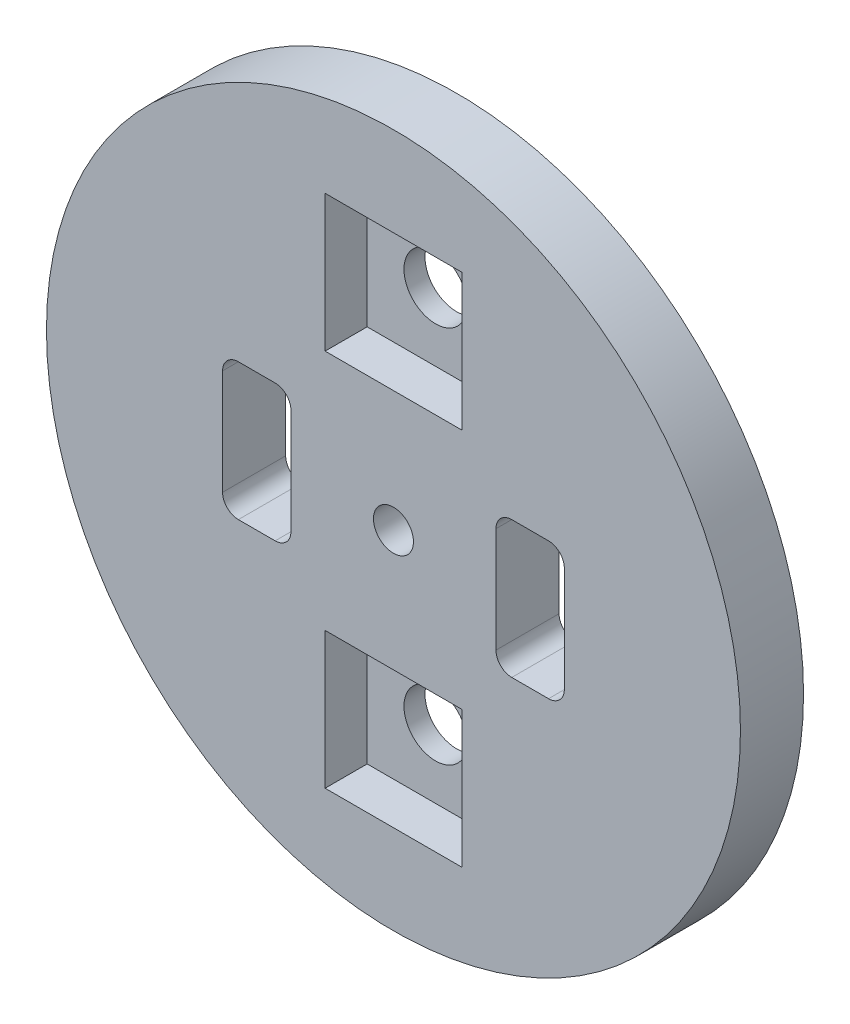
ISO-10303-21;
HEADER;
FILE_DESCRIPTION(('STEP AP214'),'2;1');
FILE_NAME('part.step','',(''),(''),'','','');
FILE_SCHEMA(('AUTOMOTIVE_DESIGN { 1 0 10303 214 1 1 1 1 }'));
ENDSEC;
DATA;
#1=APPLICATION_CONTEXT('core data for automotive mechanical design processes');
#2=APPLICATION_PROTOCOL_DEFINITION('international standard','automotive_design',2000,#1);
#3=PRODUCT_CONTEXT('',#1,'mechanical');
#4=PRODUCT('Part','Part','',(#3));
#5=PRODUCT_RELATED_PRODUCT_CATEGORY('part','',(#4));
#6=PRODUCT_DEFINITION_FORMATION('','',#4);
#7=PRODUCT_DEFINITION_CONTEXT('part definition',#1,'design');
#8=PRODUCT_DEFINITION('design','',#6,#7);
#9=PRODUCT_DEFINITION_SHAPE('','',#8);
#10=(LENGTH_UNIT() NAMED_UNIT(*) SI_UNIT(.MILLI.,.METRE.));
#11=(NAMED_UNIT(*) PLANE_ANGLE_UNIT() SI_UNIT($,.RADIAN.));
#12=(NAMED_UNIT(*) SI_UNIT($,.STERADIAN.) SOLID_ANGLE_UNIT());
#13=UNCERTAINTY_MEASURE_WITH_UNIT(LENGTH_MEASURE(1.E-05),#10,'distance_accuracy_value','');
#14=(GEOMETRIC_REPRESENTATION_CONTEXT(3) GLOBAL_UNCERTAINTY_ASSIGNED_CONTEXT((#13)) GLOBAL_UNIT_ASSIGNED_CONTEXT((#10,
#11,#12)) REPRESENTATION_CONTEXT('',''));
#15=CARTESIAN_POINT('',(0.,0.,0.));
#16=DIRECTION('',(0.,0.,1.));
#17=DIRECTION('',(1.,0.,0.));
#18=AXIS2_PLACEMENT_3D('',#15,#16,#17);
#19=CARTESIAN_POINT('',(215.7478079135,250.9520199932,3.));
#20=DIRECTION('',(0.,0.,-1.));
#21=DIRECTION('',(-1.,0.,0.));
#22=AXIS2_PLACEMENT_3D('',#19,#20,#21);
#23=CYLINDRICAL_SURFACE('',#22,1.5);
#24=CARTESIAN_POINT('',(215.7478079135,250.9520199932,1.));
#25=DIRECTION('',(0.,0.,-1.));
#26=DIRECTION('',(-1.,0.,0.));
#27=AXIS2_PLACEMENT_3D('',#24,#25,#26);
#28=CIRCLE('',#27,1.5);
#29=CARTESIAN_POINT('',(214.2478079135,250.9520199932,1.));
#30=VERTEX_POINT('',#29);
#31=EDGE_CURVE('E294',#30,#30,#28,.T.);
#32=ORIENTED_EDGE('',*,*,#31,.F.);
#33=EDGE_LOOP('',(#32));
#34=FACE_BOUND('',#33,.T.);
#35=CARTESIAN_POINT('',(215.7478079135,250.9520199932,0.));
#36=DIRECTION('',(0.,0.,1.));
#37=DIRECTION('',(1.,0.,0.));
#38=AXIS2_PLACEMENT_3D('',#35,#36,#37);
#39=CIRCLE('',#38,1.5);
#40=CARTESIAN_POINT('',(217.2478079135,250.9520199932,0.));
#41=VERTEX_POINT('',#40);
#42=EDGE_CURVE('E304',#41,#41,#39,.T.);
#43=ORIENTED_EDGE('',*,*,#42,.F.);
#44=EDGE_LOOP('',(#43));
#45=FACE_BOUND('',#44,.T.);
#46=ADVANCED_FACE('F69',(#34,#45),#23,.F.);
#47=CARTESIAN_POINT('',(215.7478079135,241.9520199932,3.));
#48=DIRECTION('',(0.,0.,-1.));
#49=DIRECTION('',(-1.,0.,0.));
#50=AXIS2_PLACEMENT_3D('',#47,#48,#49);
#51=CYLINDRICAL_SURFACE('',#50,16.5);
#52=CARTESIAN_POINT('',(215.7478079135,241.9520199932,3.));
#53=DIRECTION('',(0.,0.,1.));
#54=DIRECTION('',(1.,0.,0.));
#55=AXIS2_PLACEMENT_3D('',#52,#53,#54);
#56=CIRCLE('',#55,16.5);
#57=CARTESIAN_POINT('',(232.2478079135,241.9520199932,3.));
#58=VERTEX_POINT('',#57);
#59=EDGE_CURVE('E348',#58,#58,#56,.T.);
#60=ORIENTED_EDGE('',*,*,#59,.F.);
#61=EDGE_LOOP('',(#60));
#62=FACE_BOUND('',#61,.T.);
#63=CARTESIAN_POINT('',(215.7478079135,241.9520199932,0.));
#64=DIRECTION('',(0.,0.,1.));
#65=DIRECTION('',(1.,0.,0.));
#66=AXIS2_PLACEMENT_3D('',#63,#64,#65);
#67=CIRCLE('',#66,16.5);
#68=CARTESIAN_POINT('',(232.2478079135,241.9520199932,0.));
#69=VERTEX_POINT('',#68);
#70=EDGE_CURVE('E404',#69,#69,#67,.T.);
#71=ORIENTED_EDGE('',*,*,#70,.T.);
#72=EDGE_LOOP('',(#71));
#73=FACE_BOUND('',#72,.T.);
#74=ADVANCED_FACE('F446',(#62,#73),#51,.T.);
#75=CARTESIAN_POINT('',(0.,238.7020199932,3.));
#76=DIRECTION('',(0.,-1.,0.));
#77=DIRECTION('',(0.,0.,-1.));
#78=AXIS2_PLACEMENT_3D('',#75,#76,#77);
#79=PLANE('',#78);
#80=DIRECTION('',(-1.,0.,0.));
#81=VECTOR('',#80,1.);
#82=CARTESIAN_POINT('',(0.,238.7020199932,0.));
#83=LINE('',#82,#81);
#84=CARTESIAN_POINT('',(210.1228079135,238.7020199932,0.));
#85=VERTEX_POINT('',#84);
#86=CARTESIAN_POINT('',(208.3728079135,238.7020199932,0.));
#87=VERTEX_POINT('',#86);
#88=EDGE_CURVE('E383',#85,#87,#83,.T.);
#89=ORIENTED_EDGE('',*,*,#88,.T.);
#90=DIRECTION('',(0.,0.,-1.));
#91=VECTOR('',#90,1.);
#92=CARTESIAN_POINT('',(208.3728079135,238.7020199932,3.));
#93=LINE('',#92,#91);
#94=CARTESIAN_POINT('',(208.3728079135,238.7020199932,3.));
#95=VERTEX_POINT('',#94);
#96=EDGE_CURVE('E78',#95,#87,#93,.T.);
#97=ORIENTED_EDGE('',*,*,#96,.F.);
#98=DIRECTION('',(-1.,0.,0.));
#99=VECTOR('',#98,1.);
#100=CARTESIAN_POINT('',(0.,238.7020199932,3.));
#101=LINE('',#100,#99);
#102=CARTESIAN_POINT('',(210.1228079135,238.7020199932,3.));
#103=VERTEX_POINT('',#102);
#104=EDGE_CURVE('E331',#103,#95,#101,.T.);
#105=ORIENTED_EDGE('',*,*,#104,.F.);
#106=DIRECTION('',(0.,0.,-1.));
#107=VECTOR('',#106,1.);
#108=CARTESIAN_POINT('',(210.1228079135,238.7020199932,3.));
#109=LINE('',#108,#107);
#110=EDGE_CURVE('E12',#103,#85,#109,.T.);
#111=ORIENTED_EDGE('',*,*,#110,.T.);
#112=EDGE_LOOP('',(#89,#97,#105,#111));
#113=FACE_BOUND('',#112,.T.);
#114=ADVANCED_FACE('F505',(#113),#79,.F.);
#115=CARTESIAN_POINT('',(208.3728079135,239.4520199932,3.));
#116=DIRECTION('',(0.,0.,-1.));
#117=DIRECTION('',(-1.,0.,0.));
#118=AXIS2_PLACEMENT_3D('',#115,#116,#117);
#119=CYLINDRICAL_SURFACE('',#118,0.750000000000237);
#120=CARTESIAN_POINT('',(208.3728079135,239.4520199932,0.));
#121=DIRECTION('',(0.,0.,1.));
#122=DIRECTION('',(1.,0.,0.));
#123=AXIS2_PLACEMENT_3D('',#120,#121,#122);
#124=CIRCLE('',#123,0.750000000000237);
#125=CARTESIAN_POINT('',(207.6228079135,239.4520199932,0.));
#126=VERTEX_POINT('',#125);
#127=EDGE_CURVE('E386',#126,#87,#124,.T.);
#128=ORIENTED_EDGE('',*,*,#127,.F.);
#129=DIRECTION('',(0.,0.,-1.));
#130=VECTOR('',#129,1.);
#131=CARTESIAN_POINT('',(207.6228079135,239.4520199932,3.));
#132=LINE('',#131,#130);
#133=CARTESIAN_POINT('',(207.6228079135,239.4520199932,3.));
#134=VERTEX_POINT('',#133);
#135=EDGE_CURVE('E420',#134,#126,#132,.T.);
#136=ORIENTED_EDGE('',*,*,#135,.F.);
#137=CARTESIAN_POINT('',(208.3728079135,239.4520199932,3.));
#138=DIRECTION('',(0.,0.,1.));
#139=DIRECTION('',(1.,0.,0.));
#140=AXIS2_PLACEMENT_3D('',#137,#138,#139);
#141=CIRCLE('',#140,0.750000000000237);
#142=EDGE_CURVE('E333',#134,#95,#141,.T.);
#143=ORIENTED_EDGE('',*,*,#142,.T.);
#144=ORIENTED_EDGE('',*,*,#96,.T.);
#145=EDGE_LOOP('',(#128,#136,#143,#144));
#146=FACE_BOUND('',#145,.T.);
#147=ADVANCED_FACE('F527',(#146),#119,.F.);
#148=CARTESIAN_POINT('',(207.6228079135,0.,3.));
#149=DIRECTION('',(-1.,0.,0.));
#150=DIRECTION('',(0.,0.,1.));
#151=AXIS2_PLACEMENT_3D('',#148,#149,#150);
#152=PLANE('',#151);
#153=DIRECTION('',(0.,1.,0.));
#154=VECTOR('',#153,1.);
#155=CARTESIAN_POINT('',(207.6228079135,0.,0.));
#156=LINE('',#155,#154);
#157=CARTESIAN_POINT('',(207.6228079135,244.4520199932,0.));
#158=VERTEX_POINT('',#157);
#159=EDGE_CURVE('E389',#126,#158,#156,.T.);
#160=ORIENTED_EDGE('',*,*,#159,.T.);
#161=DIRECTION('',(0.,0.,-1.));
#162=VECTOR('',#161,1.);
#163=CARTESIAN_POINT('',(207.6228079135,244.4520199932,3.));
#164=LINE('',#163,#162);
#165=CARTESIAN_POINT('',(207.6228079135,244.4520199932,3.));
#166=VERTEX_POINT('',#165);
#167=EDGE_CURVE('E418',#166,#158,#164,.T.);
#168=ORIENTED_EDGE('',*,*,#167,.F.);
#169=DIRECTION('',(0.,1.,0.));
#170=VECTOR('',#169,1.);
#171=CARTESIAN_POINT('',(207.6228079135,0.,3.));
#172=LINE('',#171,#170);
#173=EDGE_CURVE('E336',#134,#166,#172,.T.);
#174=ORIENTED_EDGE('',*,*,#173,.F.);
#175=ORIENTED_EDGE('',*,*,#135,.T.);
#176=EDGE_LOOP('',(#160,#168,#174,#175));
#177=FACE_BOUND('',#176,.T.);
#178=ADVANCED_FACE('F523',(#177),#152,.F.);
#179=CARTESIAN_POINT('',(208.3728079135,244.4520199932,3.));
#180=DIRECTION('',(0.,0.,-1.));
#181=DIRECTION('',(-1.,0.,0.));
#182=AXIS2_PLACEMENT_3D('',#179,#180,#181);
#183=CYLINDRICAL_SURFACE('',#182,0.750000000000001);
#184=CARTESIAN_POINT('',(208.3728079135,244.4520199932,0.));
#185=DIRECTION('',(0.,0.,1.));
#186=DIRECTION('',(1.,0.,0.));
#187=AXIS2_PLACEMENT_3D('',#184,#185,#186);
#188=CIRCLE('',#187,0.750000000000001);
#189=CARTESIAN_POINT('',(208.3728079135,245.2020199932,0.));
#190=VERTEX_POINT('',#189);
#191=EDGE_CURVE('E392',#190,#158,#188,.T.);
#192=ORIENTED_EDGE('',*,*,#191,.F.);
#193=DIRECTION('',(0.,0.,-1.));
#194=VECTOR('',#193,1.);
#195=CARTESIAN_POINT('',(208.3728079135,245.2020199932,3.));
#196=LINE('',#195,#194);
#197=CARTESIAN_POINT('',(208.3728079135,245.2020199932,3.));
#198=VERTEX_POINT('',#197);
#199=EDGE_CURVE('E416',#198,#190,#196,.T.);
#200=ORIENTED_EDGE('',*,*,#199,.F.);
#201=CARTESIAN_POINT('',(208.3728079135,244.4520199932,3.));
#202=DIRECTION('',(0.,0.,1.));
#203=DIRECTION('',(1.,0.,0.));
#204=AXIS2_PLACEMENT_3D('',#201,#202,#203);
#205=CIRCLE('',#204,0.750000000000001);
#206=EDGE_CURVE('E338',#198,#166,#205,.T.);
#207=ORIENTED_EDGE('',*,*,#206,.T.);
#208=ORIENTED_EDGE('',*,*,#167,.T.);
#209=EDGE_LOOP('',(#192,#200,#207,#208));
#210=FACE_BOUND('',#209,.T.);
#211=ADVANCED_FACE('F519',(#210),#183,.F.);
#212=CARTESIAN_POINT('',(0.,245.2020199932,3.));
#213=DIRECTION('',(0.,1.,0.));
#214=DIRECTION('',(0.,0.,1.));
#215=AXIS2_PLACEMENT_3D('',#212,#213,#214);
#216=PLANE('',#215);
#217=DIRECTION('',(1.,0.,0.));
#218=VECTOR('',#217,1.);
#219=CARTESIAN_POINT('',(0.,245.2020199932,0.));
#220=LINE('',#219,#218);
#221=CARTESIAN_POINT('',(210.1228079135,245.2020199932,0.));
#222=VERTEX_POINT('',#221);
#223=EDGE_CURVE('E395',#190,#222,#220,.T.);
#224=ORIENTED_EDGE('',*,*,#223,.T.);
#225=DIRECTION('',(0.,0.,-1.));
#226=VECTOR('',#225,1.);
#227=CARTESIAN_POINT('',(210.1228079135,245.2020199932,3.));
#228=LINE('',#227,#226);
#229=CARTESIAN_POINT('',(210.1228079135,245.2020199932,3.));
#230=VERTEX_POINT('',#229);
#231=EDGE_CURVE('E414',#230,#222,#228,.T.);
#232=ORIENTED_EDGE('',*,*,#231,.F.);
#233=DIRECTION('',(1.,0.,0.));
#234=VECTOR('',#233,1.);
#235=CARTESIAN_POINT('',(0.,245.2020199932,3.));
#236=LINE('',#235,#234);
#237=EDGE_CURVE('E341',#198,#230,#236,.T.);
#238=ORIENTED_EDGE('',*,*,#237,.F.);
#239=ORIENTED_EDGE('',*,*,#199,.T.);
#240=EDGE_LOOP('',(#224,#232,#238,#239));
#241=FACE_BOUND('',#240,.T.);
#242=ADVANCED_FACE('F515',(#241),#216,.F.);
#243=CARTESIAN_POINT('',(210.1228079135,244.4520199932,3.));
#244=DIRECTION('',(0.,0.,-1.));
#245=DIRECTION('',(-1.,0.,0.));
#246=AXIS2_PLACEMENT_3D('',#243,#244,#245);
#247=CYLINDRICAL_SURFACE('',#246,0.750000000000001);
#248=CARTESIAN_POINT('',(210.1228079135,244.4520199932,0.));
#249=DIRECTION('',(0.,0.,1.));
#250=DIRECTION('',(1.,0.,0.));
#251=AXIS2_PLACEMENT_3D('',#248,#249,#250);
#252=CIRCLE('',#251,0.750000000000001);
#253=CARTESIAN_POINT('',(210.8728079135,244.4520199932,0.));
#254=VERTEX_POINT('',#253);
#255=EDGE_CURVE('E398',#254,#222,#252,.T.);
#256=ORIENTED_EDGE('',*,*,#255,.F.);
#257=DIRECTION('',(0.,0.,-1.));
#258=VECTOR('',#257,1.);
#259=CARTESIAN_POINT('',(210.8728079135,244.4520199932,3.));
#260=LINE('',#259,#258);
#261=CARTESIAN_POINT('',(210.8728079135,244.4520199932,3.));
#262=VERTEX_POINT('',#261);
#263=EDGE_CURVE('E411',#262,#254,#260,.T.);
#264=ORIENTED_EDGE('',*,*,#263,.F.);
#265=CARTESIAN_POINT('',(210.1228079135,244.4520199932,3.));
#266=DIRECTION('',(0.,0.,1.));
#267=DIRECTION('',(1.,0.,0.));
#268=AXIS2_PLACEMENT_3D('',#265,#266,#267);
#269=CIRCLE('',#268,0.750000000000001);
#270=EDGE_CURVE('E343',#262,#230,#269,.T.);
#271=ORIENTED_EDGE('',*,*,#270,.T.);
#272=ORIENTED_EDGE('',*,*,#231,.T.);
#273=EDGE_LOOP('',(#256,#264,#271,#272));
#274=FACE_BOUND('',#273,.T.);
#275=ADVANCED_FACE('F511',(#274),#247,.F.);
#276=CARTESIAN_POINT('',(210.8728079135,0.,3.));
#277=DIRECTION('',(1.,0.,0.));
#278=DIRECTION('',(0.,0.,-1.));
#279=AXIS2_PLACEMENT_3D('',#276,#277,#278);
#280=PLANE('',#279);
#281=DIRECTION('',(0.,-1.,0.));
#282=VECTOR('',#281,1.);
#283=CARTESIAN_POINT('',(210.8728079135,0.,0.));
#284=LINE('',#283,#282);
#285=CARTESIAN_POINT('',(210.8728079135,239.4520199932,0.));
#286=VERTEX_POINT('',#285);
#287=EDGE_CURVE('E401',#254,#286,#284,.T.);
#288=ORIENTED_EDGE('',*,*,#287,.T.);
#289=DIRECTION('',(0.,0.,-1.));
#290=VECTOR('',#289,1.);
#291=CARTESIAN_POINT('',(210.8728079135,239.4520199932,3.));
#292=LINE('',#291,#290);
#293=CARTESIAN_POINT('',(210.8728079135,239.4520199932,3.));
#294=VERTEX_POINT('',#293);
#295=EDGE_CURVE('E409',#294,#286,#292,.T.);
#296=ORIENTED_EDGE('',*,*,#295,.F.);
#297=DIRECTION('',(0.,-1.,0.));
#298=VECTOR('',#297,1.);
#299=CARTESIAN_POINT('',(210.8728079135,0.,3.));
#300=LINE('',#299,#298);
#301=EDGE_CURVE('E346',#262,#294,#300,.T.);
#302=ORIENTED_EDGE('',*,*,#301,.F.);
#303=ORIENTED_EDGE('',*,*,#263,.T.);
#304=EDGE_LOOP('',(#288,#296,#302,#303));
#305=FACE_BOUND('',#304,.T.);
#306=ADVANCED_FACE('F507',(#305),#280,.F.);
#307=CARTESIAN_POINT('',(210.1228079135,239.4520199932,3.));
#308=DIRECTION('',(0.,0.,-1.));
#309=DIRECTION('',(-1.,0.,0.));
#310=AXIS2_PLACEMENT_3D('',#307,#308,#309);
#311=CYLINDRICAL_SURFACE('',#310,0.750000000000001);
#312=CARTESIAN_POINT('',(210.1228079135,239.4520199932,0.));
#313=DIRECTION('',(0.,0.,1.));
#314=DIRECTION('',(1.,0.,0.));
#315=AXIS2_PLACEMENT_3D('',#312,#313,#314);
#316=CIRCLE('',#315,0.750000000000001);
#317=EDGE_CURVE('E380',#85,#286,#316,.T.);
#318=ORIENTED_EDGE('',*,*,#317,.F.);
#319=ORIENTED_EDGE('',*,*,#110,.F.);
#320=CARTESIAN_POINT('',(210.1228079135,239.4520199932,3.));
#321=DIRECTION('',(0.,0.,1.));
#322=DIRECTION('',(1.,0.,0.));
#323=AXIS2_PLACEMENT_3D('',#320,#321,#322);
#324=CIRCLE('',#323,0.750000000000001);
#325=EDGE_CURVE('E328',#103,#294,#324,.T.);
#326=ORIENTED_EDGE('',*,*,#325,.T.);
#327=ORIENTED_EDGE('',*,*,#295,.T.);
#328=EDGE_LOOP('',(#318,#319,#326,#327));
#329=FACE_BOUND('',#328,.T.);
#330=ADVANCED_FACE('F510',(#329),#311,.F.);
#331=CARTESIAN_POINT('',(220.6228079135,0.,3.));
#332=DIRECTION('',(1.,0.,0.));
#333=DIRECTION('',(0.,0.,-1.));
#334=AXIS2_PLACEMENT_3D('',#331,#332,#333);
#335=PLANE('',#334);
#336=DIRECTION('',(0.,-1.,0.));
#337=VECTOR('',#336,1.);
#338=CARTESIAN_POINT('',(220.6228079135,0.,0.));
#339=LINE('',#338,#337);
#340=CARTESIAN_POINT('',(220.6228079135,244.4520199932,0.));
#341=VERTEX_POINT('',#340);
#342=CARTESIAN_POINT('',(220.6228079135,239.4520199932,0.));
#343=VERTEX_POINT('',#342);
#344=EDGE_CURVE('E359',#341,#343,#339,.T.);
#345=ORIENTED_EDGE('',*,*,#344,.F.);
#346=DIRECTION('',(0.,0.,-1.));
#347=VECTOR('',#346,1.);
#348=CARTESIAN_POINT('',(220.6228079135,244.4520199932,3.));
#349=LINE('',#348,#347);
#350=CARTESIAN_POINT('',(220.6228079135,244.4520199932,3.));
#351=VERTEX_POINT('',#350);
#352=EDGE_CURVE('E434',#351,#341,#349,.T.);
#353=ORIENTED_EDGE('',*,*,#352,.F.);
#354=DIRECTION('',(0.,-1.,0.));
#355=VECTOR('',#354,1.);
#356=CARTESIAN_POINT('',(220.6228079135,0.,3.));
#357=LINE('',#356,#355);
#358=CARTESIAN_POINT('',(220.6228079135,239.4520199932,3.));
#359=VERTEX_POINT('',#358);
#360=EDGE_CURVE('E307',#351,#359,#357,.T.);
#361=ORIENTED_EDGE('',*,*,#360,.T.);
#362=DIRECTION('',(0.,0.,-1.));
#363=VECTOR('',#362,1.);
#364=CARTESIAN_POINT('',(220.6228079135,239.4520199932,3.));
#365=LINE('',#364,#363);
#366=EDGE_CURVE('E412',#359,#343,#365,.T.);
#367=ORIENTED_EDGE('',*,*,#366,.T.);
#368=EDGE_LOOP('',(#345,#353,#361,#367));
#369=FACE_BOUND('',#368,.T.);
#370=ADVANCED_FACE('F537',(#369),#335,.T.);
#371=CARTESIAN_POINT('',(221.3728079135,244.4520199932,3.));
#372=DIRECTION('',(0.,0.,-1.));
#373=DIRECTION('',(-1.,0.,0.));
#374=AXIS2_PLACEMENT_3D('',#371,#372,#373);
#375=CYLINDRICAL_SURFACE('',#374,0.750000000000001);
#376=CARTESIAN_POINT('',(221.3728079135,244.4520199932,0.));
#377=DIRECTION('',(0.,0.,1.));
#378=DIRECTION('',(1.,0.,0.));
#379=AXIS2_PLACEMENT_3D('',#376,#377,#378);
#380=CIRCLE('',#379,0.750000000000001);
#381=CARTESIAN_POINT('',(221.3728079135,245.2020199932,0.));
#382=VERTEX_POINT('',#381);
#383=EDGE_CURVE('E362',#382,#341,#380,.T.);
#384=ORIENTED_EDGE('',*,*,#383,.F.);
#385=DIRECTION('',(0.,0.,-1.));
#386=VECTOR('',#385,1.);
#387=CARTESIAN_POINT('',(221.3728079135,245.2020199932,3.));
#388=LINE('',#387,#386);
#389=CARTESIAN_POINT('',(221.3728079135,245.2020199932,3.));
#390=VERTEX_POINT('',#389);
#391=EDGE_CURVE('E432',#390,#382,#388,.T.);
#392=ORIENTED_EDGE('',*,*,#391,.F.);
#393=CARTESIAN_POINT('',(221.3728079135,244.4520199932,3.));
#394=DIRECTION('',(0.,0.,1.));
#395=DIRECTION('',(1.,0.,0.));
#396=AXIS2_PLACEMENT_3D('',#393,#394,#395);
#397=CIRCLE('',#396,0.750000000000001);
#398=EDGE_CURVE('E310',#390,#351,#397,.T.);
#399=ORIENTED_EDGE('',*,*,#398,.T.);
#400=ORIENTED_EDGE('',*,*,#352,.T.);
#401=EDGE_LOOP('',(#384,#392,#399,#400));
#402=FACE_BOUND('',#401,.T.);
#403=ADVANCED_FACE('F559',(#402),#375,.F.);
#404=CARTESIAN_POINT('',(0.,245.2020199932,3.));
#405=DIRECTION('',(0.,-1.,0.));
#406=DIRECTION('',(0.,0.,-1.));
#407=AXIS2_PLACEMENT_3D('',#404,#405,#406);
#408=PLANE('',#407);
#409=DIRECTION('',(-1.,0.,0.));
#410=VECTOR('',#409,1.);
#411=CARTESIAN_POINT('',(0.,245.2020199932,0.));
#412=LINE('',#411,#410);
#413=CARTESIAN_POINT('',(223.1228079135,245.2020199932,0.));
#414=VERTEX_POINT('',#413);
#415=EDGE_CURVE('E365',#414,#382,#412,.T.);
#416=ORIENTED_EDGE('',*,*,#415,.F.);
#417=DIRECTION('',(0.,0.,-1.));
#418=VECTOR('',#417,1.);
#419=CARTESIAN_POINT('',(223.1228079135,245.2020199932,3.));
#420=LINE('',#419,#418);
#421=CARTESIAN_POINT('',(223.1228079135,245.2020199932,3.));
#422=VERTEX_POINT('',#421);
#423=EDGE_CURVE('E430',#422,#414,#420,.T.);
#424=ORIENTED_EDGE('',*,*,#423,.F.);
#425=DIRECTION('',(-1.,0.,0.));
#426=VECTOR('',#425,1.);
#427=CARTESIAN_POINT('',(0.,245.2020199932,3.));
#428=LINE('',#427,#426);
#429=EDGE_CURVE('E313',#422,#390,#428,.T.);
#430=ORIENTED_EDGE('',*,*,#429,.T.);
#431=ORIENTED_EDGE('',*,*,#391,.T.);
#432=EDGE_LOOP('',(#416,#424,#430,#431));
#433=FACE_BOUND('',#432,.T.);
#434=ADVANCED_FACE('F555',(#433),#408,.T.);
#435=CARTESIAN_POINT('',(223.1228079135,244.4520199932,3.));
#436=DIRECTION('',(0.,0.,-1.));
#437=DIRECTION('',(-1.,0.,0.));
#438=AXIS2_PLACEMENT_3D('',#435,#436,#437);
#439=CYLINDRICAL_SURFACE('',#438,0.750000000000001);
#440=CARTESIAN_POINT('',(223.1228079135,244.4520199932,0.));
#441=DIRECTION('',(0.,0.,1.));
#442=DIRECTION('',(1.,0.,0.));
#443=AXIS2_PLACEMENT_3D('',#440,#441,#442);
#444=CIRCLE('',#443,0.750000000000001);
#445=CARTESIAN_POINT('',(223.8728079135,244.4520199932,0.));
#446=VERTEX_POINT('',#445);
#447=EDGE_CURVE('E368',#446,#414,#444,.T.);
#448=ORIENTED_EDGE('',*,*,#447,.F.);
#449=DIRECTION('',(0.,0.,-1.));
#450=VECTOR('',#449,1.);
#451=CARTESIAN_POINT('',(223.8728079135,244.4520199932,3.));
#452=LINE('',#451,#450);
#453=CARTESIAN_POINT('',(223.8728079135,244.4520199932,3.));
#454=VERTEX_POINT('',#453);
#455=EDGE_CURVE('E428',#454,#446,#452,.T.);
#456=ORIENTED_EDGE('',*,*,#455,.F.);
#457=CARTESIAN_POINT('',(223.1228079135,244.4520199932,3.));
#458=DIRECTION('',(0.,0.,1.));
#459=DIRECTION('',(1.,0.,0.));
#460=AXIS2_PLACEMENT_3D('',#457,#458,#459);
#461=CIRCLE('',#460,0.750000000000001);
#462=EDGE_CURVE('E316',#454,#422,#461,.T.);
#463=ORIENTED_EDGE('',*,*,#462,.T.);
#464=ORIENTED_EDGE('',*,*,#423,.T.);
#465=EDGE_LOOP('',(#448,#456,#463,#464));
#466=FACE_BOUND('',#465,.T.);
#467=ADVANCED_FACE('F551',(#466),#439,.F.);
#468=CARTESIAN_POINT('',(223.8728079135,0.,3.));
#469=DIRECTION('',(-1.,0.,0.));
#470=DIRECTION('',(0.,0.,1.));
#471=AXIS2_PLACEMENT_3D('',#468,#469,#470);
#472=PLANE('',#471);
#473=DIRECTION('',(0.,1.,0.));
#474=VECTOR('',#473,1.);
#475=CARTESIAN_POINT('',(223.8728079135,0.,0.));
#476=LINE('',#475,#474);
#477=CARTESIAN_POINT('',(223.8728079135,239.4520199932,0.));
#478=VERTEX_POINT('',#477);
#479=EDGE_CURVE('E371',#478,#446,#476,.T.);
#480=ORIENTED_EDGE('',*,*,#479,.F.);
#481=DIRECTION('',(0.,0.,-1.));
#482=VECTOR('',#481,1.);
#483=CARTESIAN_POINT('',(223.8728079135,239.4520199932,3.));
#484=LINE('',#483,#482);
#485=CARTESIAN_POINT('',(223.8728079135,239.4520199932,3.));
#486=VERTEX_POINT('',#485);
#487=EDGE_CURVE('E426',#486,#478,#484,.T.);
#488=ORIENTED_EDGE('',*,*,#487,.F.);
#489=DIRECTION('',(0.,1.,0.));
#490=VECTOR('',#489,1.);
#491=CARTESIAN_POINT('',(223.8728079135,0.,3.));
#492=LINE('',#491,#490);
#493=EDGE_CURVE('E319',#486,#454,#492,.T.);
#494=ORIENTED_EDGE('',*,*,#493,.T.);
#495=ORIENTED_EDGE('',*,*,#455,.T.);
#496=EDGE_LOOP('',(#480,#488,#494,#495));
#497=FACE_BOUND('',#496,.T.);
#498=ADVANCED_FACE('F547',(#497),#472,.T.);
#499=CARTESIAN_POINT('',(223.1228079135,239.4520199932,3.));
#500=DIRECTION('',(0.,0.,-1.));
#501=DIRECTION('',(-1.,0.,0.));
#502=AXIS2_PLACEMENT_3D('',#499,#500,#501);
#503=CYLINDRICAL_SURFACE('',#502,0.750000000000001);
#504=CARTESIAN_POINT('',(223.1228079135,239.4520199932,0.));
#505=DIRECTION('',(0.,0.,1.));
#506=DIRECTION('',(1.,0.,0.));
#507=AXIS2_PLACEMENT_3D('',#504,#505,#506);
#508=CIRCLE('',#507,0.750000000000001);
#509=CARTESIAN_POINT('',(223.1228079135,238.7020199932,0.));
#510=VERTEX_POINT('',#509);
#511=EDGE_CURVE('E374',#510,#478,#508,.T.);
#512=ORIENTED_EDGE('',*,*,#511,.F.);
#513=DIRECTION('',(0.,0.,-1.));
#514=VECTOR('',#513,1.);
#515=CARTESIAN_POINT('',(223.1228079135,238.7020199932,3.));
#516=LINE('',#515,#514);
#517=CARTESIAN_POINT('',(223.1228079135,238.7020199932,3.));
#518=VERTEX_POINT('',#517);
#519=EDGE_CURVE('E424',#518,#510,#516,.T.);
#520=ORIENTED_EDGE('',*,*,#519,.F.);
#521=CARTESIAN_POINT('',(223.1228079135,239.4520199932,3.));
#522=DIRECTION('',(0.,0.,1.));
#523=DIRECTION('',(1.,0.,0.));
#524=AXIS2_PLACEMENT_3D('',#521,#522,#523);
#525=CIRCLE('',#524,0.750000000000001);
#526=EDGE_CURVE('E322',#518,#486,#525,.T.);
#527=ORIENTED_EDGE('',*,*,#526,.T.);
#528=ORIENTED_EDGE('',*,*,#487,.T.);
#529=EDGE_LOOP('',(#512,#520,#527,#528));
#530=FACE_BOUND('',#529,.T.);
#531=ADVANCED_FACE('F543',(#530),#503,.F.);
#532=CARTESIAN_POINT('',(0.,238.7020199932,3.));
#533=DIRECTION('',(0.,1.,0.));
#534=DIRECTION('',(0.,0.,1.));
#535=AXIS2_PLACEMENT_3D('',#532,#533,#534);
#536=PLANE('',#535);
#537=DIRECTION('',(1.,0.,0.));
#538=VECTOR('',#537,1.);
#539=CARTESIAN_POINT('',(0.,238.7020199932,0.));
#540=LINE('',#539,#538);
#541=CARTESIAN_POINT('',(221.3728079135,238.7020199932,0.));
#542=VERTEX_POINT('',#541);
#543=EDGE_CURVE('E377',#542,#510,#540,.T.);
#544=ORIENTED_EDGE('',*,*,#543,.F.);
#545=DIRECTION('',(0.,0.,-1.));
#546=VECTOR('',#545,1.);
#547=CARTESIAN_POINT('',(221.3728079135,238.7020199932,3.));
#548=LINE('',#547,#546);
#549=CARTESIAN_POINT('',(221.3728079135,238.7020199932,3.));
#550=VERTEX_POINT('',#549);
#551=EDGE_CURVE('E351',#550,#542,#548,.T.);
#552=ORIENTED_EDGE('',*,*,#551,.F.);
#553=DIRECTION('',(1.,0.,0.));
#554=VECTOR('',#553,1.);
#555=CARTESIAN_POINT('',(0.,238.7020199932,3.));
#556=LINE('',#555,#554);
#557=EDGE_CURVE('E325',#550,#518,#556,.T.);
#558=ORIENTED_EDGE('',*,*,#557,.T.);
#559=ORIENTED_EDGE('',*,*,#519,.T.);
#560=EDGE_LOOP('',(#544,#552,#558,#559));
#561=FACE_BOUND('',#560,.T.);
#562=ADVANCED_FACE('F539',(#561),#536,.T.);
#563=CARTESIAN_POINT('',(221.3728079135,239.4520199932,3.));
#564=DIRECTION('',(0.,0.,-1.));
#565=DIRECTION('',(-1.,0.,0.));
#566=AXIS2_PLACEMENT_3D('',#563,#564,#565);
#567=CYLINDRICAL_SURFACE('',#566,0.750000000000001);
#568=CARTESIAN_POINT('',(221.3728079135,239.4520199932,0.));
#569=DIRECTION('',(0.,0.,1.));
#570=DIRECTION('',(1.,0.,0.));
#571=AXIS2_PLACEMENT_3D('',#568,#569,#570);
#572=CIRCLE('',#571,0.750000000000001);
#573=EDGE_CURVE('E355',#343,#542,#572,.T.);
#574=ORIENTED_EDGE('',*,*,#573,.F.);
#575=ORIENTED_EDGE('',*,*,#366,.F.);
#576=CARTESIAN_POINT('',(221.3728079135,239.4520199932,3.));
#577=DIRECTION('',(0.,0.,1.));
#578=DIRECTION('',(1.,0.,0.));
#579=AXIS2_PLACEMENT_3D('',#576,#577,#578);
#580=CIRCLE('',#579,0.750000000000001);
#581=EDGE_CURVE('E303',#359,#550,#580,.T.);
#582=ORIENTED_EDGE('',*,*,#581,.T.);
#583=ORIENTED_EDGE('',*,*,#551,.T.);
#584=EDGE_LOOP('',(#574,#575,#582,#583));
#585=FACE_BOUND('',#584,.T.);
#586=ADVANCED_FACE('F542',(#585),#567,.F.);
#587=CARTESIAN_POINT('',(215.7478079135,241.9520199932,3.));
#588=DIRECTION('',(0.,0.,-1.));
#589=DIRECTION('',(-1.,0.,0.));
#590=AXIS2_PLACEMENT_3D('',#587,#588,#589);
#591=CYLINDRICAL_SURFACE('',#590,0.950000000000006);
#592=CARTESIAN_POINT('',(215.7478079135,241.9520199932,3.));
#593=DIRECTION('',(0.,0.,1.));
#594=DIRECTION('',(1.,0.,0.));
#595=AXIS2_PLACEMENT_3D('',#592,#593,#594);
#596=CIRCLE('',#595,0.950000000000006);
#597=CARTESIAN_POINT('',(216.6978079135,241.9520199932,3.));
#598=VERTEX_POINT('',#597);
#599=EDGE_CURVE('E300',#598,#598,#596,.T.);
#600=ORIENTED_EDGE('',*,*,#599,.T.);
#601=EDGE_LOOP('',(#600));
#602=FACE_BOUND('',#601,.T.);
#603=CARTESIAN_POINT('',(215.7478079135,241.9520199932,0.));
#604=DIRECTION('',(0.,0.,1.));
#605=DIRECTION('',(1.,0.,0.));
#606=AXIS2_PLACEMENT_3D('',#603,#604,#605);
#607=CIRCLE('',#606,0.950000000000006);
#608=CARTESIAN_POINT('',(216.6978079135,241.9520199932,0.));
#609=VERTEX_POINT('',#608);
#610=EDGE_CURVE('E352',#609,#609,#607,.T.);
#611=ORIENTED_EDGE('',*,*,#610,.F.);
#612=EDGE_LOOP('',(#611));
#613=FACE_BOUND('',#612,.T.);
#614=ADVANCED_FACE('F454',(#602,#613),#591,.F.);
#615=CARTESIAN_POINT('',(0.,0.,0.));
#616=DIRECTION('',(0.,0.,1.));
#617=DIRECTION('',(1.,0.,0.));
#618=AXIS2_PLACEMENT_3D('',#615,#616,#617);
#619=PLANE('',#618);
#620=ORIENTED_EDGE('',*,*,#610,.T.);
#621=EDGE_LOOP('',(#620));
#622=FACE_BOUND('',#621,.T.);
#623=ORIENTED_EDGE('',*,*,#573,.T.);
#624=ORIENTED_EDGE('',*,*,#543,.T.);
#625=ORIENTED_EDGE('',*,*,#511,.T.);
#626=ORIENTED_EDGE('',*,*,#479,.T.);
#627=ORIENTED_EDGE('',*,*,#447,.T.);
#628=ORIENTED_EDGE('',*,*,#415,.T.);
#629=ORIENTED_EDGE('',*,*,#383,.T.);
#630=ORIENTED_EDGE('',*,*,#344,.T.);
#631=EDGE_LOOP('',(#623,#624,#625,#626,#627,#628,#629,#630));
#632=FACE_BOUND('',#631,.T.);
#633=ORIENTED_EDGE('',*,*,#317,.T.);
#634=ORIENTED_EDGE('',*,*,#287,.F.);
#635=ORIENTED_EDGE('',*,*,#255,.T.);
#636=ORIENTED_EDGE('',*,*,#223,.F.);
#637=ORIENTED_EDGE('',*,*,#191,.T.);
#638=ORIENTED_EDGE('',*,*,#159,.F.);
#639=ORIENTED_EDGE('',*,*,#127,.T.);
#640=ORIENTED_EDGE('',*,*,#88,.F.);
#641=EDGE_LOOP('',(#633,#634,#635,#636,#637,#638,#639,#640));
#642=FACE_BOUND('',#641,.T.);
#643=ORIENTED_EDGE('',*,*,#70,.F.);
#644=EDGE_LOOP('',(#643));
#645=FACE_BOUND('',#644,.T.);
#646=ORIENTED_EDGE('',*,*,#42,.T.);
#647=EDGE_LOOP('',(#646));
#648=FACE_BOUND('',#647,.T.);
#649=CARTESIAN_POINT('',(215.7478079135,232.9520199932,0.));
#650=DIRECTION('',(0.,0.,1.));
#651=DIRECTION('',(1.,0.,0.));
#652=AXIS2_PLACEMENT_3D('',#649,#650,#651);
#653=CIRCLE('',#652,1.5);
#654=CARTESIAN_POINT('',(217.2478079135,232.9520199932,0.));
#655=VERTEX_POINT('',#654);
#656=EDGE_CURVE('E356',#655,#655,#653,.T.);
#657=ORIENTED_EDGE('',*,*,#656,.T.);
#658=EDGE_LOOP('',(#657));
#659=FACE_BOUND('',#658,.T.);
#660=ADVANCED_FACE('F450',(#622,#632,#642,#645,#648,#659),#619,.F.);
#661=CARTESIAN_POINT('',(0.,0.,3.));
#662=DIRECTION('',(0.,0.,1.));
#663=DIRECTION('',(1.,0.,0.));
#664=AXIS2_PLACEMENT_3D('',#661,#662,#663);
#665=PLANE('',#664);
#666=DIRECTION('',(0.,-1.,0.));
#667=VECTOR('',#666,1.);
#668=CARTESIAN_POINT('',(212.4978079135,236.2020199932,3.));
#669=LINE('',#668,#667);
#670=CARTESIAN_POINT('',(212.4978079135,236.2020199932,3.));
#671=VERTEX_POINT('',#670);
#672=CARTESIAN_POINT('',(212.4978079135,229.7020199932,3.));
#673=VERTEX_POINT('',#672);
#674=EDGE_CURVE('E86',#671,#673,#669,.T.);
#675=ORIENTED_EDGE('',*,*,#674,.F.);
#676=DIRECTION('',(-1.,0.,0.));
#677=VECTOR('',#676,1.);
#678=CARTESIAN_POINT('',(218.9978079135,236.2020199932,3.));
#679=LINE('',#678,#677);
#680=CARTESIAN_POINT('',(218.9978079135,236.2020199932,3.));
#681=VERTEX_POINT('',#680);
#682=EDGE_CURVE('E251',#681,#671,#679,.T.);
#683=ORIENTED_EDGE('',*,*,#682,.F.);
#684=DIRECTION('',(0.,1.,0.));
#685=VECTOR('',#684,1.);
#686=CARTESIAN_POINT('',(218.9978079135,236.2020199932,3.));
#687=LINE('',#686,#685);
#688=CARTESIAN_POINT('',(218.9978079135,229.7020199932,3.));
#689=VERTEX_POINT('',#688);
#690=EDGE_CURVE('E254',#689,#681,#687,.T.);
#691=ORIENTED_EDGE('',*,*,#690,.F.);
#692=DIRECTION('',(1.,0.,0.));
#693=VECTOR('',#692,1.);
#694=CARTESIAN_POINT('',(218.9978079135,229.7020199932,3.));
#695=LINE('',#694,#693);
#696=EDGE_CURVE('E260',#673,#689,#695,.T.);
#697=ORIENTED_EDGE('',*,*,#696,.F.);
#698=EDGE_LOOP('',(#675,#683,#691,#697));
#699=FACE_BOUND('',#698,.T.);
#700=DIRECTION('',(0.,-1.,0.));
#701=VECTOR('',#700,1.);
#702=CARTESIAN_POINT('',(212.4978079135,254.2020199932,3.));
#703=LINE('',#702,#701);
#704=CARTESIAN_POINT('',(212.4978079135,254.2020199932,3.));
#705=VERTEX_POINT('',#704);
#706=CARTESIAN_POINT('',(212.4978079135,247.7020199932,3.));
#707=VERTEX_POINT('',#706);
#708=EDGE_CURVE('E94',#705,#707,#703,.T.);
#709=ORIENTED_EDGE('',*,*,#708,.F.);
#710=DIRECTION('',(-1.,0.,0.));
#711=VECTOR('',#710,1.);
#712=CARTESIAN_POINT('',(218.9978079135,254.2020199932,3.));
#713=LINE('',#712,#711);
#714=CARTESIAN_POINT('',(218.9978079135,254.2020199932,3.));
#715=VERTEX_POINT('',#714);
#716=EDGE_CURVE('E273',#715,#705,#713,.T.);
#717=ORIENTED_EDGE('',*,*,#716,.F.);
#718=DIRECTION('',(0.,1.,0.));
#719=VECTOR('',#718,1.);
#720=CARTESIAN_POINT('',(218.9978079135,254.2020199932,3.));
#721=LINE('',#720,#719);
#722=CARTESIAN_POINT('',(218.9978079135,247.7020199932,3.));
#723=VERTEX_POINT('',#722);
#724=EDGE_CURVE('E287',#723,#715,#721,.T.);
#725=ORIENTED_EDGE('',*,*,#724,.F.);
#726=DIRECTION('',(1.,0.,0.));
#727=VECTOR('',#726,1.);
#728=CARTESIAN_POINT('',(218.9978079135,247.7020199932,3.));
#729=LINE('',#728,#727);
#730=EDGE_CURVE('E284',#707,#723,#729,.T.);
#731=ORIENTED_EDGE('',*,*,#730,.F.);
#732=EDGE_LOOP('',(#709,#717,#725,#731));
#733=FACE_BOUND('',#732,.T.);
#734=ORIENTED_EDGE('',*,*,#599,.F.);
#735=EDGE_LOOP('',(#734));
#736=FACE_BOUND('',#735,.T.);
#737=ORIENTED_EDGE('',*,*,#581,.F.);
#738=ORIENTED_EDGE('',*,*,#360,.F.);
#739=ORIENTED_EDGE('',*,*,#398,.F.);
#740=ORIENTED_EDGE('',*,*,#429,.F.);
#741=ORIENTED_EDGE('',*,*,#462,.F.);
#742=ORIENTED_EDGE('',*,*,#493,.F.);
#743=ORIENTED_EDGE('',*,*,#526,.F.);
#744=ORIENTED_EDGE('',*,*,#557,.F.);
#745=EDGE_LOOP('',(#737,#738,#739,#740,#741,#742,#743,#744));
#746=FACE_BOUND('',#745,.T.);
#747=ORIENTED_EDGE('',*,*,#325,.F.);
#748=ORIENTED_EDGE('',*,*,#104,.T.);
#749=ORIENTED_EDGE('',*,*,#142,.F.);
#750=ORIENTED_EDGE('',*,*,#173,.T.);
#751=ORIENTED_EDGE('',*,*,#206,.F.);
#752=ORIENTED_EDGE('',*,*,#237,.T.);
#753=ORIENTED_EDGE('',*,*,#270,.F.);
#754=ORIENTED_EDGE('',*,*,#301,.T.);
#755=EDGE_LOOP('',(#747,#748,#749,#750,#751,#752,#753,#754));
#756=FACE_BOUND('',#755,.T.);
#757=ORIENTED_EDGE('',*,*,#59,.T.);
#758=EDGE_LOOP('',(#757));
#759=FACE_BOUND('',#758,.T.);
#760=ADVANCED_FACE('F453',(#699,#733,#736,#746,#756,#759),#665,.T.);
#761=CARTESIAN_POINT('',(215.7478079135,232.9520199932,3.));
#762=DIRECTION('',(0.,0.,-1.));
#763=DIRECTION('',(-1.,0.,0.));
#764=AXIS2_PLACEMENT_3D('',#761,#762,#763);
#765=CYLINDRICAL_SURFACE('',#764,1.5);
#766=CARTESIAN_POINT('',(215.7478079135,232.9520199932,1.));
#767=DIRECTION('',(0.,0.,-1.));
#768=DIRECTION('',(-1.,0.,0.));
#769=AXIS2_PLACEMENT_3D('',#766,#767,#768);
#770=CIRCLE('',#769,1.5);
#771=CARTESIAN_POINT('',(214.2478079135,232.9520199932,1.));
#772=VERTEX_POINT('',#771);
#773=EDGE_CURVE('E73',#772,#772,#770,.T.);
#774=ORIENTED_EDGE('',*,*,#773,.F.);
#775=EDGE_LOOP('',(#774));
#776=FACE_BOUND('',#775,.T.);
#777=ORIENTED_EDGE('',*,*,#656,.F.);
#778=EDGE_LOOP('',(#777));
#779=FACE_BOUND('',#778,.T.);
#780=ADVANCED_FACE('F71',(#776,#779),#765,.F.);
#781=CARTESIAN_POINT('',(212.4978079135,254.2020199932,1.));
#782=DIRECTION('',(-1.,0.,0.));
#783=DIRECTION('',(0.,0.,1.));
#784=AXIS2_PLACEMENT_3D('',#781,#782,#783);
#785=PLANE('',#784);
#786=ORIENTED_EDGE('',*,*,#708,.T.);
#787=DIRECTION('',(0.,0.,1.));
#788=VECTOR('',#787,1.);
#789=CARTESIAN_POINT('',(212.4978079135,247.7020199932,1.));
#790=LINE('',#789,#788);
#791=CARTESIAN_POINT('',(212.4978079135,247.7020199932,1.));
#792=VERTEX_POINT('',#791);
#793=EDGE_CURVE('E282',#792,#707,#790,.T.);
#794=ORIENTED_EDGE('',*,*,#793,.F.);
#795=DIRECTION('',(0.,-1.,0.));
#796=VECTOR('',#795,1.);
#797=CARTESIAN_POINT('',(212.4978079135,254.2020199932,1.));
#798=LINE('',#797,#796);
#799=CARTESIAN_POINT('',(212.4978079135,254.2020199932,1.));
#800=VERTEX_POINT('',#799);
#801=EDGE_CURVE('E269',#800,#792,#798,.T.);
#802=ORIENTED_EDGE('',*,*,#801,.F.);
#803=DIRECTION('',(0.,0.,1.));
#804=VECTOR('',#803,1.);
#805=CARTESIAN_POINT('',(212.4978079135,254.2020199932,1.));
#806=LINE('',#805,#804);
#807=EDGE_CURVE('E292',#800,#705,#806,.T.);
#808=ORIENTED_EDGE('',*,*,#807,.T.);
#809=EDGE_LOOP('',(#786,#794,#802,#808));
#810=FACE_BOUND('',#809,.T.);
#811=ADVANCED_FACE('F460',(#810),#785,.F.);
#812=CARTESIAN_POINT('',(218.9978079135,254.2020199932,1.));
#813=DIRECTION('',(0.,1.,0.));
#814=DIRECTION('',(0.,0.,1.));
#815=AXIS2_PLACEMENT_3D('',#812,#813,#814);
#816=PLANE('',#815);
#817=ORIENTED_EDGE('',*,*,#716,.T.);
#818=ORIENTED_EDGE('',*,*,#807,.F.);
#819=DIRECTION('',(-1.,0.,0.));
#820=VECTOR('',#819,1.);
#821=CARTESIAN_POINT('',(218.9978079135,254.2020199932,1.));
#822=LINE('',#821,#820);
#823=CARTESIAN_POINT('',(218.9978079135,254.2020199932,1.));
#824=VERTEX_POINT('',#823);
#825=EDGE_CURVE('E279',#824,#800,#822,.T.);
#826=ORIENTED_EDGE('',*,*,#825,.F.);
#827=DIRECTION('',(0.,0.,1.));
#828=VECTOR('',#827,1.);
#829=CARTESIAN_POINT('',(218.9978079135,254.2020199932,1.));
#830=LINE('',#829,#828);
#831=EDGE_CURVE('E295',#824,#715,#830,.T.);
#832=ORIENTED_EDGE('',*,*,#831,.T.);
#833=EDGE_LOOP('',(#817,#818,#826,#832));
#834=FACE_BOUND('',#833,.T.);
#835=ADVANCED_FACE('F466',(#834),#816,.F.);
#836=CARTESIAN_POINT('',(218.9978079135,254.2020199932,1.));
#837=DIRECTION('',(1.,0.,0.));
#838=DIRECTION('',(0.,0.,-1.));
#839=AXIS2_PLACEMENT_3D('',#836,#837,#838);
#840=PLANE('',#839);
#841=ORIENTED_EDGE('',*,*,#724,.T.);
#842=ORIENTED_EDGE('',*,*,#831,.F.);
#843=DIRECTION('',(0.,1.,0.));
#844=VECTOR('',#843,1.);
#845=CARTESIAN_POINT('',(218.9978079135,254.2020199932,1.));
#846=LINE('',#845,#844);
#847=CARTESIAN_POINT('',(218.9978079135,247.7020199932,1.));
#848=VERTEX_POINT('',#847);
#849=EDGE_CURVE('E276',#848,#824,#846,.T.);
#850=ORIENTED_EDGE('',*,*,#849,.F.);
#851=DIRECTION('',(0.,0.,1.));
#852=VECTOR('',#851,1.);
#853=CARTESIAN_POINT('',(218.9978079135,247.7020199932,1.));
#854=LINE('',#853,#852);
#855=EDGE_CURVE('E297',#848,#723,#854,.T.);
#856=ORIENTED_EDGE('',*,*,#855,.T.);
#857=EDGE_LOOP('',(#841,#842,#850,#856));
#858=FACE_BOUND('',#857,.T.);
#859=ADVANCED_FACE('F495',(#858),#840,.F.);
#860=CARTESIAN_POINT('',(218.9978079135,247.7020199932,1.));
#861=DIRECTION('',(0.,-1.,0.));
#862=DIRECTION('',(0.,0.,-1.));
#863=AXIS2_PLACEMENT_3D('',#860,#861,#862);
#864=PLANE('',#863);
#865=ORIENTED_EDGE('',*,*,#730,.T.);
#866=ORIENTED_EDGE('',*,*,#855,.F.);
#867=DIRECTION('',(1.,0.,0.));
#868=VECTOR('',#867,1.);
#869=CARTESIAN_POINT('',(218.9978079135,247.7020199932,1.));
#870=LINE('',#869,#868);
#871=EDGE_CURVE('E272',#792,#848,#870,.T.);
#872=ORIENTED_EDGE('',*,*,#871,.F.);
#873=ORIENTED_EDGE('',*,*,#793,.T.);
#874=EDGE_LOOP('',(#865,#866,#872,#873));
#875=FACE_BOUND('',#874,.T.);
#876=ADVANCED_FACE('F492',(#875),#864,.F.);
#877=CARTESIAN_POINT('',(0.,0.,1.));
#878=DIRECTION('',(0.,0.,-1.));
#879=DIRECTION('',(-1.,0.,0.));
#880=AXIS2_PLACEMENT_3D('',#877,#878,#879);
#881=PLANE('',#880);
#882=ORIENTED_EDGE('',*,*,#31,.T.);
#883=EDGE_LOOP('',(#882));
#884=FACE_BOUND('',#883,.T.);
#885=ORIENTED_EDGE('',*,*,#801,.T.);
#886=ORIENTED_EDGE('',*,*,#871,.T.);
#887=ORIENTED_EDGE('',*,*,#849,.T.);
#888=ORIENTED_EDGE('',*,*,#825,.T.);
#889=EDGE_LOOP('',(#885,#886,#887,#888));
#890=FACE_BOUND('',#889,.T.);
#891=ADVANCED_FACE('F441',(#884,#890),#881,.F.);
#892=CARTESIAN_POINT('',(212.4978079135,236.2020199932,1.));
#893=DIRECTION('',(-1.,0.,0.));
#894=DIRECTION('',(0.,0.,1.));
#895=AXIS2_PLACEMENT_3D('',#892,#893,#894);
#896=PLANE('',#895);
#897=ORIENTED_EDGE('',*,*,#674,.T.);
#898=DIRECTION('',(0.,0.,1.));
#899=VECTOR('',#898,1.);
#900=CARTESIAN_POINT('',(212.4978079135,229.7020199932,1.));
#901=LINE('',#900,#899);
#902=CARTESIAN_POINT('',(212.4978079135,229.7020199932,1.));
#903=VERTEX_POINT('',#902);
#904=EDGE_CURVE('E229',#903,#673,#901,.T.);
#905=ORIENTED_EDGE('',*,*,#904,.F.);
#906=DIRECTION('',(0.,-1.,0.));
#907=VECTOR('',#906,1.);
#908=CARTESIAN_POINT('',(212.4978079135,236.2020199932,1.));
#909=LINE('',#908,#907);
#910=CARTESIAN_POINT('',(212.4978079135,236.2020199932,1.));
#911=VERTEX_POINT('',#910);
#912=EDGE_CURVE('E233',#911,#903,#909,.T.);
#913=ORIENTED_EDGE('',*,*,#912,.F.);
#914=DIRECTION('',(0.,0.,1.));
#915=VECTOR('',#914,1.);
#916=CARTESIAN_POINT('',(212.4978079135,236.2020199932,1.));
#917=LINE('',#916,#915);
#918=EDGE_CURVE('E264',#911,#671,#917,.T.);
#919=ORIENTED_EDGE('',*,*,#918,.T.);
#920=EDGE_LOOP('',(#897,#905,#913,#919));
#921=FACE_BOUND('',#920,.T.);
#922=ADVANCED_FACE('F231',(#921),#896,.F.);
#923=CARTESIAN_POINT('',(218.9978079135,236.2020199932,1.));
#924=DIRECTION('',(0.,1.,0.));
#925=DIRECTION('',(0.,0.,1.));
#926=AXIS2_PLACEMENT_3D('',#923,#924,#925);
#927=PLANE('',#926);
#928=ORIENTED_EDGE('',*,*,#682,.T.);
#929=ORIENTED_EDGE('',*,*,#918,.F.);
#930=DIRECTION('',(-1.,0.,0.));
#931=VECTOR('',#930,1.);
#932=CARTESIAN_POINT('',(218.9978079135,236.2020199932,1.));
#933=LINE('',#932,#931);
#934=CARTESIAN_POINT('',(218.9978079135,236.2020199932,1.));
#935=VERTEX_POINT('',#934);
#936=EDGE_CURVE('E239',#935,#911,#933,.T.);
#937=ORIENTED_EDGE('',*,*,#936,.F.);
#938=DIRECTION('',(0.,0.,1.));
#939=VECTOR('',#938,1.);
#940=CARTESIAN_POINT('',(218.9978079135,236.2020199932,1.));
#941=LINE('',#940,#939);
#942=EDGE_CURVE('E266',#935,#681,#941,.T.);
#943=ORIENTED_EDGE('',*,*,#942,.T.);
#944=EDGE_LOOP('',(#928,#929,#937,#943));
#945=FACE_BOUND('',#944,.T.);
#946=ADVANCED_FACE('F481',(#945),#927,.F.);
#947=CARTESIAN_POINT('',(218.9978079135,236.2020199932,1.));
#948=DIRECTION('',(1.,0.,0.));
#949=DIRECTION('',(0.,0.,-1.));
#950=AXIS2_PLACEMENT_3D('',#947,#948,#949);
#951=PLANE('',#950);
#952=ORIENTED_EDGE('',*,*,#690,.T.);
#953=ORIENTED_EDGE('',*,*,#942,.F.);
#954=DIRECTION('',(0.,1.,0.));
#955=VECTOR('',#954,1.);
#956=CARTESIAN_POINT('',(218.9978079135,236.2020199932,1.));
#957=LINE('',#956,#955);
#958=CARTESIAN_POINT('',(218.9978079135,229.7020199932,1.));
#959=VERTEX_POINT('',#958);
#960=EDGE_CURVE('E247',#959,#935,#957,.T.);
#961=ORIENTED_EDGE('',*,*,#960,.F.);
#962=DIRECTION('',(0.,0.,1.));
#963=VECTOR('',#962,1.);
#964=CARTESIAN_POINT('',(218.9978079135,229.7020199932,1.));
#965=LINE('',#964,#963);
#966=EDGE_CURVE('E238',#959,#689,#965,.T.);
#967=ORIENTED_EDGE('',*,*,#966,.T.);
#968=EDGE_LOOP('',(#952,#953,#961,#967));
#969=FACE_BOUND('',#968,.T.);
#970=ADVANCED_FACE('F478',(#969),#951,.F.);
#971=CARTESIAN_POINT('',(218.9978079135,229.7020199932,1.));
#972=DIRECTION('',(0.,-1.,0.));
#973=DIRECTION('',(0.,0.,-1.));
#974=AXIS2_PLACEMENT_3D('',#971,#972,#973);
#975=PLANE('',#974);
#976=ORIENTED_EDGE('',*,*,#696,.T.);
#977=ORIENTED_EDGE('',*,*,#966,.F.);
#978=DIRECTION('',(1.,0.,0.));
#979=VECTOR('',#978,1.);
#980=CARTESIAN_POINT('',(218.9978079135,229.7020199932,1.));
#981=LINE('',#980,#979);
#982=EDGE_CURVE('E242',#903,#959,#981,.T.);
#983=ORIENTED_EDGE('',*,*,#982,.F.);
#984=ORIENTED_EDGE('',*,*,#904,.T.);
#985=EDGE_LOOP('',(#976,#977,#983,#984));
#986=FACE_BOUND('',#985,.T.);
#987=ADVANCED_FACE('F243',(#986),#975,.F.);
#988=CARTESIAN_POINT('',(0.,0.,1.));
#989=DIRECTION('',(0.,0.,-1.));
#990=DIRECTION('',(-1.,0.,0.));
#991=AXIS2_PLACEMENT_3D('',#988,#989,#990);
#992=PLANE('',#991);
#993=ORIENTED_EDGE('',*,*,#773,.T.);
#994=EDGE_LOOP('',(#993));
#995=FACE_BOUND('',#994,.T.);
#996=ORIENTED_EDGE('',*,*,#912,.T.);
#997=ORIENTED_EDGE('',*,*,#982,.T.);
#998=ORIENTED_EDGE('',*,*,#960,.T.);
#999=ORIENTED_EDGE('',*,*,#936,.T.);
#1000=EDGE_LOOP('',(#996,#997,#998,#999));
#1001=FACE_BOUND('',#1000,.T.);
#1002=ADVANCED_FACE('F249',(#995,#1001),#992,.F.);
#1003=CLOSED_SHELL('',(#46,#74,#114,#147,#178,#211,#242,#275,#306,#330,#370,#403,#434,#467,#498,
#531,#562,#586,#614,#660,#760,#780,#811,#835,#859,#876,#891,#922,#946,#970,#987,#1002));
#1004=MANIFOLD_SOLID_BREP('B2',#1003);
#1005=ADVANCED_BREP_SHAPE_REPRESENTATION('',(#18,#1004),#14);
#1006=SHAPE_DEFINITION_REPRESENTATION(#9,#1005);
ENDSEC;
END-ISO-10303-21;
